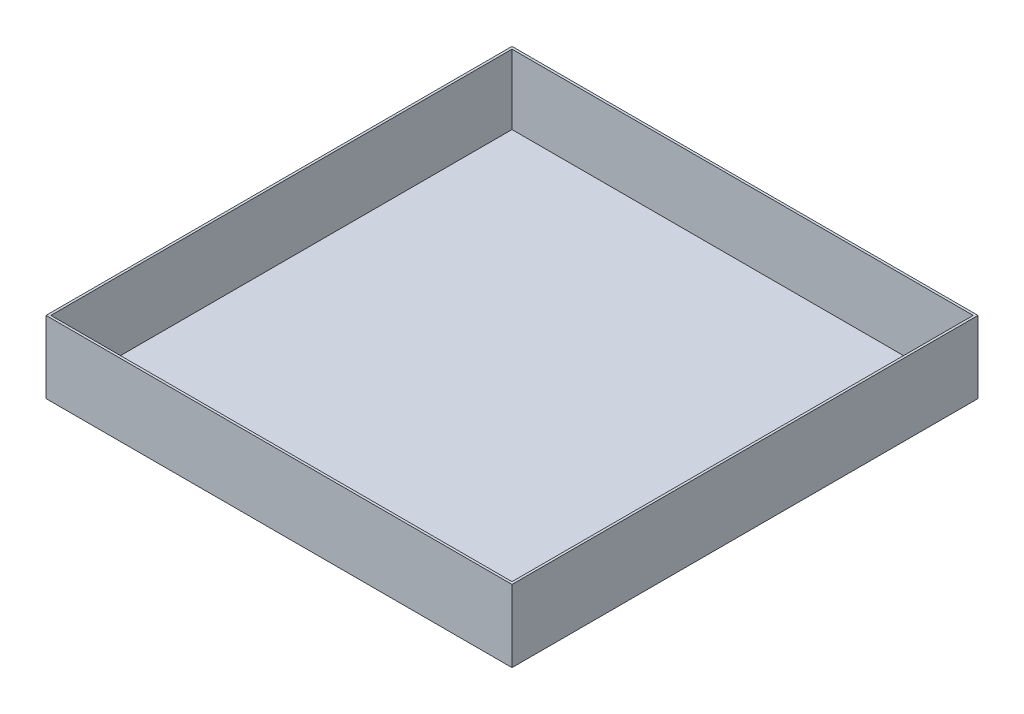
ISO-10303-21;
HEADER;
FILE_DESCRIPTION(('STEP AP214'),'2;1');
FILE_NAME('part.step','',(''),(''),'','','');
FILE_SCHEMA(('AUTOMOTIVE_DESIGN { 1 0 10303 214 1 1 1 1 }'));
ENDSEC;
DATA;
#1=APPLICATION_CONTEXT('core data for automotive mechanical design processes');
#2=APPLICATION_PROTOCOL_DEFINITION('international standard','automotive_design',2000,#1);
#3=PRODUCT_CONTEXT('',#1,'mechanical');
#4=PRODUCT('Part','Part','',(#3));
#5=PRODUCT_RELATED_PRODUCT_CATEGORY('part','',(#4));
#6=PRODUCT_DEFINITION_FORMATION('','',#4);
#7=PRODUCT_DEFINITION_CONTEXT('part definition',#1,'design');
#8=PRODUCT_DEFINITION('design','',#6,#7);
#9=PRODUCT_DEFINITION_SHAPE('','',#8);
#10=(LENGTH_UNIT() NAMED_UNIT(*) SI_UNIT(.MILLI.,.METRE.));
#11=(NAMED_UNIT(*) PLANE_ANGLE_UNIT() SI_UNIT($,.RADIAN.));
#12=(NAMED_UNIT(*) SI_UNIT($,.STERADIAN.) SOLID_ANGLE_UNIT());
#13=UNCERTAINTY_MEASURE_WITH_UNIT(LENGTH_MEASURE(1.E-05),#10,'distance_accuracy_value','');
#14=(GEOMETRIC_REPRESENTATION_CONTEXT(3) GLOBAL_UNCERTAINTY_ASSIGNED_CONTEXT((#13)) GLOBAL_UNIT_ASSIGNED_CONTEXT((#10,
#11,#12)) REPRESENTATION_CONTEXT('',''));
#15=CARTESIAN_POINT('',(0.,0.,0.));
#16=DIRECTION('',(0.,0.,1.));
#17=DIRECTION('',(1.,0.,0.));
#18=AXIS2_PLACEMENT_3D('',#15,#16,#17);
#19=CARTESIAN_POINT('',(0.,30.,0.));
#20=DIRECTION('',(0.,-1.,0.));
#21=DIRECTION('',(0.,0.,-1.));
#22=AXIS2_PLACEMENT_3D('',#19,#20,#21);
#23=PLANE('',#22);
#24=DIRECTION('',(0.,0.,1.));
#25=VECTOR('',#24,1.);
#26=CARTESIAN_POINT('',(0.,30.,0.));
#27=LINE('',#26,#25);
#28=CARTESIAN_POINT('',(0.,30.,-194.));
#29=VERTEX_POINT('',#28);
#30=CARTESIAN_POINT('',(0.,30.,0.));
#31=VERTEX_POINT('',#30);
#32=EDGE_CURVE('E157',#29,#31,#27,.T.);
#33=ORIENTED_EDGE('',*,*,#32,.T.);
#34=DIRECTION('',(1.,0.,0.));
#35=VECTOR('',#34,1.);
#36=CARTESIAN_POINT('',(0.,30.,0.));
#37=LINE('',#36,#35);
#38=CARTESIAN_POINT('',(194.,30.,0.));
#39=VERTEX_POINT('',#38);
#40=EDGE_CURVE('E92',#31,#39,#37,.T.);
#41=ORIENTED_EDGE('',*,*,#40,.T.);
#42=DIRECTION('',(0.,0.,-1.));
#43=VECTOR('',#42,1.);
#44=CARTESIAN_POINT('',(194.,30.,0.));
#45=LINE('',#44,#43);
#46=CARTESIAN_POINT('',(194.,30.,-194.));
#47=VERTEX_POINT('',#46);
#48=EDGE_CURVE('E162',#39,#47,#45,.T.);
#49=ORIENTED_EDGE('',*,*,#48,.T.);
#50=DIRECTION('',(-1.,0.,0.));
#51=VECTOR('',#50,1.);
#52=CARTESIAN_POINT('',(0.,30.,-194.));
#53=LINE('',#52,#51);
#54=EDGE_CURVE('E64',#47,#29,#53,.T.);
#55=ORIENTED_EDGE('',*,*,#54,.T.);
#56=EDGE_LOOP('',(#33,#41,#49,#55));
#57=FACE_BOUND('',#56,.T.);
#58=DIRECTION('',(0.,0.,1.));
#59=VECTOR('',#58,1.);
#60=CARTESIAN_POINT('',(1.,30.,0.));
#61=LINE('',#60,#59);
#62=CARTESIAN_POINT('',(1.,30.,-193.));
#63=VERTEX_POINT('',#62);
#64=CARTESIAN_POINT('',(1.,30.,-1.));
#65=VERTEX_POINT('',#64);
#66=EDGE_CURVE('E141',#63,#65,#61,.T.);
#67=ORIENTED_EDGE('',*,*,#66,.F.);
#68=DIRECTION('',(-1.,0.,0.));
#69=VECTOR('',#68,1.);
#70=CARTESIAN_POINT('',(0.,30.,-193.));
#71=LINE('',#70,#69);
#72=CARTESIAN_POINT('',(193.,30.,-193.));
#73=VERTEX_POINT('',#72);
#74=EDGE_CURVE('E154',#73,#63,#71,.T.);
#75=ORIENTED_EDGE('',*,*,#74,.F.);
#76=DIRECTION('',(0.,0.,-1.));
#77=VECTOR('',#76,1.);
#78=CARTESIAN_POINT('',(193.,30.,0.));
#79=LINE('',#78,#77);
#80=CARTESIAN_POINT('',(193.,30.,-1.));
#81=VERTEX_POINT('',#80);
#82=EDGE_CURVE('E151',#81,#73,#79,.T.);
#83=ORIENTED_EDGE('',*,*,#82,.F.);
#84=DIRECTION('',(1.,0.,0.));
#85=VECTOR('',#84,1.);
#86=CARTESIAN_POINT('',(0.,30.,-1.));
#87=LINE('',#86,#85);
#88=EDGE_CURVE('E130',#65,#81,#87,.T.);
#89=ORIENTED_EDGE('',*,*,#88,.F.);
#90=EDGE_LOOP('',(#67,#75,#83,#89));
#91=FACE_BOUND('',#90,.T.);
#92=ADVANCED_FACE('F39',(#57,#91),#23,.F.);
#93=CARTESIAN_POINT('',(0.,30.,0.));
#94=DIRECTION('',(1.,0.,0.));
#95=DIRECTION('',(0.,0.,-1.));
#96=AXIS2_PLACEMENT_3D('',#93,#94,#95);
#97=PLANE('',#96);
#98=DIRECTION('',(0.,0.,1.));
#99=VECTOR('',#98,1.);
#100=CARTESIAN_POINT('',(0.,0.,0.));
#101=LINE('',#100,#99);
#102=CARTESIAN_POINT('',(0.,0.,-194.));
#103=VERTEX_POINT('',#102);
#104=CARTESIAN_POINT('',(0.,0.,0.));
#105=VERTEX_POINT('',#104);
#106=EDGE_CURVE('E168',#103,#105,#101,.T.);
#107=ORIENTED_EDGE('',*,*,#106,.T.);
#108=DIRECTION('',(0.,-1.,0.));
#109=VECTOR('',#108,1.);
#110=CARTESIAN_POINT('',(0.,30.,0.));
#111=LINE('',#110,#109);
#112=EDGE_CURVE('E11',#31,#105,#111,.T.);
#113=ORIENTED_EDGE('',*,*,#112,.F.);
#114=ORIENTED_EDGE('',*,*,#32,.F.);
#115=DIRECTION('',(0.,-1.,0.));
#116=VECTOR('',#115,1.);
#117=CARTESIAN_POINT('',(0.,30.,-194.));
#118=LINE('',#117,#116);
#119=EDGE_CURVE('E167',#29,#103,#118,.T.);
#120=ORIENTED_EDGE('',*,*,#119,.T.);
#121=EDGE_LOOP('',(#107,#113,#114,#120));
#122=FACE_BOUND('',#121,.T.);
#123=ADVANCED_FACE('F41',(#122),#97,.F.);
#124=CARTESIAN_POINT('',(0.,30.,0.));
#125=DIRECTION('',(0.,0.,-1.));
#126=DIRECTION('',(-1.,0.,0.));
#127=AXIS2_PLACEMENT_3D('',#124,#125,#126);
#128=PLANE('',#127);
#129=DIRECTION('',(1.,0.,0.));
#130=VECTOR('',#129,1.);
#131=CARTESIAN_POINT('',(0.,0.,0.));
#132=LINE('',#131,#130);
#133=CARTESIAN_POINT('',(194.,0.,0.));
#134=VERTEX_POINT('',#133);
#135=EDGE_CURVE('E172',#105,#134,#132,.T.);
#136=ORIENTED_EDGE('',*,*,#135,.T.);
#137=DIRECTION('',(0.,-1.,0.));
#138=VECTOR('',#137,1.);
#139=CARTESIAN_POINT('',(194.,30.,0.));
#140=LINE('',#139,#138);
#141=EDGE_CURVE('E48',#39,#134,#140,.T.);
#142=ORIENTED_EDGE('',*,*,#141,.F.);
#143=ORIENTED_EDGE('',*,*,#40,.F.);
#144=ORIENTED_EDGE('',*,*,#112,.T.);
#145=EDGE_LOOP('',(#136,#142,#143,#144));
#146=FACE_BOUND('',#145,.T.);
#147=ADVANCED_FACE('F206',(#146),#128,.F.);
#148=CARTESIAN_POINT('',(194.,30.,0.));
#149=DIRECTION('',(-1.,0.,0.));
#150=DIRECTION('',(0.,0.,1.));
#151=AXIS2_PLACEMENT_3D('',#148,#149,#150);
#152=PLANE('',#151);
#153=DIRECTION('',(0.,0.,-1.));
#154=VECTOR('',#153,1.);
#155=CARTESIAN_POINT('',(194.,0.,0.));
#156=LINE('',#155,#154);
#157=CARTESIAN_POINT('',(194.,0.,-194.));
#158=VERTEX_POINT('',#157);
#159=EDGE_CURVE('E175',#134,#158,#156,.T.);
#160=ORIENTED_EDGE('',*,*,#159,.T.);
#161=DIRECTION('',(0.,-1.,0.));
#162=VECTOR('',#161,1.);
#163=CARTESIAN_POINT('',(194.,30.,-194.));
#164=LINE('',#163,#162);
#165=EDGE_CURVE('E182',#47,#158,#164,.T.);
#166=ORIENTED_EDGE('',*,*,#165,.F.);
#167=ORIENTED_EDGE('',*,*,#48,.F.);
#168=ORIENTED_EDGE('',*,*,#141,.T.);
#169=EDGE_LOOP('',(#160,#166,#167,#168));
#170=FACE_BOUND('',#169,.T.);
#171=ADVANCED_FACE('F189',(#170),#152,.F.);
#172=CARTESIAN_POINT('',(0.,30.,-194.));
#173=DIRECTION('',(0.,0.,1.));
#174=DIRECTION('',(1.,0.,0.));
#175=AXIS2_PLACEMENT_3D('',#172,#173,#174);
#176=PLANE('',#175);
#177=DIRECTION('',(-1.,0.,0.));
#178=VECTOR('',#177,1.);
#179=CARTESIAN_POINT('',(0.,0.,-194.));
#180=LINE('',#179,#178);
#181=EDGE_CURVE('E85',#158,#103,#180,.T.);
#182=ORIENTED_EDGE('',*,*,#181,.T.);
#183=ORIENTED_EDGE('',*,*,#119,.F.);
#184=ORIENTED_EDGE('',*,*,#54,.F.);
#185=ORIENTED_EDGE('',*,*,#165,.T.);
#186=EDGE_LOOP('',(#182,#183,#184,#185));
#187=FACE_BOUND('',#186,.T.);
#188=ADVANCED_FACE('F197',(#187),#176,.F.);
#189=CARTESIAN_POINT('',(0.,0.,0.));
#190=DIRECTION('',(0.,-1.,0.));
#191=DIRECTION('',(0.,0.,-1.));
#192=AXIS2_PLACEMENT_3D('',#189,#190,#191);
#193=PLANE('',#192);
#194=ORIENTED_EDGE('',*,*,#106,.F.);
#195=ORIENTED_EDGE('',*,*,#181,.F.);
#196=ORIENTED_EDGE('',*,*,#159,.F.);
#197=ORIENTED_EDGE('',*,*,#135,.F.);
#198=EDGE_LOOP('',(#194,#195,#196,#197));
#199=FACE_BOUND('',#198,.T.);
#200=ADVANCED_FACE('F193',(#199),#193,.T.);
#201=CARTESIAN_POINT('',(1.,30.,0.));
#202=DIRECTION('',(1.,0.,0.));
#203=DIRECTION('',(0.,0.,-1.));
#204=AXIS2_PLACEMENT_3D('',#201,#202,#203);
#205=PLANE('',#204);
#206=DIRECTION('',(0.,0.,1.));
#207=VECTOR('',#206,1.);
#208=CARTESIAN_POINT('',(1.,1.,0.));
#209=LINE('',#208,#207);
#210=CARTESIAN_POINT('',(1.,1.,-193.));
#211=VERTEX_POINT('',#210);
#212=CARTESIAN_POINT('',(1.,1.,-1.));
#213=VERTEX_POINT('',#212);
#214=EDGE_CURVE('E120',#211,#213,#209,.T.);
#215=ORIENTED_EDGE('',*,*,#214,.F.);
#216=DIRECTION('',(0.,-1.,0.));
#217=VECTOR('',#216,1.);
#218=CARTESIAN_POINT('',(1.,30.,-193.));
#219=LINE('',#218,#217);
#220=EDGE_CURVE('E145',#63,#211,#219,.T.);
#221=ORIENTED_EDGE('',*,*,#220,.F.);
#222=ORIENTED_EDGE('',*,*,#66,.T.);
#223=DIRECTION('',(0.,-1.,0.));
#224=VECTOR('',#223,1.);
#225=CARTESIAN_POINT('',(1.,30.,-1.));
#226=LINE('',#225,#224);
#227=EDGE_CURVE('E134',#65,#213,#226,.T.);
#228=ORIENTED_EDGE('',*,*,#227,.T.);
#229=EDGE_LOOP('',(#215,#221,#222,#228));
#230=FACE_BOUND('',#229,.T.);
#231=ADVANCED_FACE('F204',(#230),#205,.T.);
#232=CARTESIAN_POINT('',(0.,30.,-1.));
#233=DIRECTION('',(0.,0.,-1.));
#234=DIRECTION('',(-1.,0.,0.));
#235=AXIS2_PLACEMENT_3D('',#232,#233,#234);
#236=PLANE('',#235);
#237=DIRECTION('',(1.,0.,0.));
#238=VECTOR('',#237,1.);
#239=CARTESIAN_POINT('',(0.,1.,-1.));
#240=LINE('',#239,#238);
#241=CARTESIAN_POINT('',(193.,1.,-1.));
#242=VERTEX_POINT('',#241);
#243=EDGE_CURVE('E114',#213,#242,#240,.T.);
#244=ORIENTED_EDGE('',*,*,#243,.F.);
#245=ORIENTED_EDGE('',*,*,#227,.F.);
#246=ORIENTED_EDGE('',*,*,#88,.T.);
#247=DIRECTION('',(0.,-1.,0.));
#248=VECTOR('',#247,1.);
#249=CARTESIAN_POINT('',(193.,30.,-1.));
#250=LINE('',#249,#248);
#251=EDGE_CURVE('E127',#81,#242,#250,.T.);
#252=ORIENTED_EDGE('',*,*,#251,.T.);
#253=EDGE_LOOP('',(#244,#245,#246,#252));
#254=FACE_BOUND('',#253,.T.);
#255=ADVANCED_FACE('F128',(#254),#236,.T.);
#256=CARTESIAN_POINT('',(193.,30.,0.));
#257=DIRECTION('',(-1.,0.,0.));
#258=DIRECTION('',(0.,0.,1.));
#259=AXIS2_PLACEMENT_3D('',#256,#257,#258);
#260=PLANE('',#259);
#261=DIRECTION('',(0.,0.,-1.));
#262=VECTOR('',#261,1.);
#263=CARTESIAN_POINT('',(193.,1.,0.));
#264=LINE('',#263,#262);
#265=CARTESIAN_POINT('',(193.,1.,-193.));
#266=VERTEX_POINT('',#265);
#267=EDGE_CURVE('E118',#242,#266,#264,.T.);
#268=ORIENTED_EDGE('',*,*,#267,.F.);
#269=ORIENTED_EDGE('',*,*,#251,.F.);
#270=ORIENTED_EDGE('',*,*,#82,.T.);
#271=DIRECTION('',(0.,-1.,0.));
#272=VECTOR('',#271,1.);
#273=CARTESIAN_POINT('',(193.,30.,-193.));
#274=LINE('',#273,#272);
#275=EDGE_CURVE('E55',#73,#266,#274,.T.);
#276=ORIENTED_EDGE('',*,*,#275,.T.);
#277=EDGE_LOOP('',(#268,#269,#270,#276));
#278=FACE_BOUND('',#277,.T.);
#279=ADVANCED_FACE('F136',(#278),#260,.T.);
#280=CARTESIAN_POINT('',(0.,30.,-193.));
#281=DIRECTION('',(0.,0.,1.));
#282=DIRECTION('',(1.,0.,0.));
#283=AXIS2_PLACEMENT_3D('',#280,#281,#282);
#284=PLANE('',#283);
#285=DIRECTION('',(-1.,0.,0.));
#286=VECTOR('',#285,1.);
#287=CARTESIAN_POINT('',(0.,1.,-193.));
#288=LINE('',#287,#286);
#289=EDGE_CURVE('E138',#266,#211,#288,.T.);
#290=ORIENTED_EDGE('',*,*,#289,.F.);
#291=ORIENTED_EDGE('',*,*,#275,.F.);
#292=ORIENTED_EDGE('',*,*,#74,.T.);
#293=ORIENTED_EDGE('',*,*,#220,.T.);
#294=EDGE_LOOP('',(#290,#291,#292,#293));
#295=FACE_BOUND('',#294,.T.);
#296=ADVANCED_FACE('F217',(#295),#284,.T.);
#297=CARTESIAN_POINT('',(0.,1.,0.));
#298=DIRECTION('',(0.,-1.,0.));
#299=DIRECTION('',(0.,0.,-1.));
#300=AXIS2_PLACEMENT_3D('',#297,#298,#299);
#301=PLANE('',#300);
#302=ORIENTED_EDGE('',*,*,#214,.T.);
#303=ORIENTED_EDGE('',*,*,#243,.T.);
#304=ORIENTED_EDGE('',*,*,#267,.T.);
#305=ORIENTED_EDGE('',*,*,#289,.T.);
#306=EDGE_LOOP('',(#302,#303,#304,#305));
#307=FACE_BOUND('',#306,.T.);
#308=ADVANCED_FACE('F116',(#307),#301,.F.);
#309=CLOSED_SHELL('',(#92,#123,#147,#171,#188,#200,#231,#255,#279,#296,#308));
#310=MANIFOLD_SOLID_BREP('B2',#309);
#311=ADVANCED_BREP_SHAPE_REPRESENTATION('',(#18,#310),#14);
#312=SHAPE_DEFINITION_REPRESENTATION(#9,#311);
ENDSEC;
END-ISO-10303-21;
